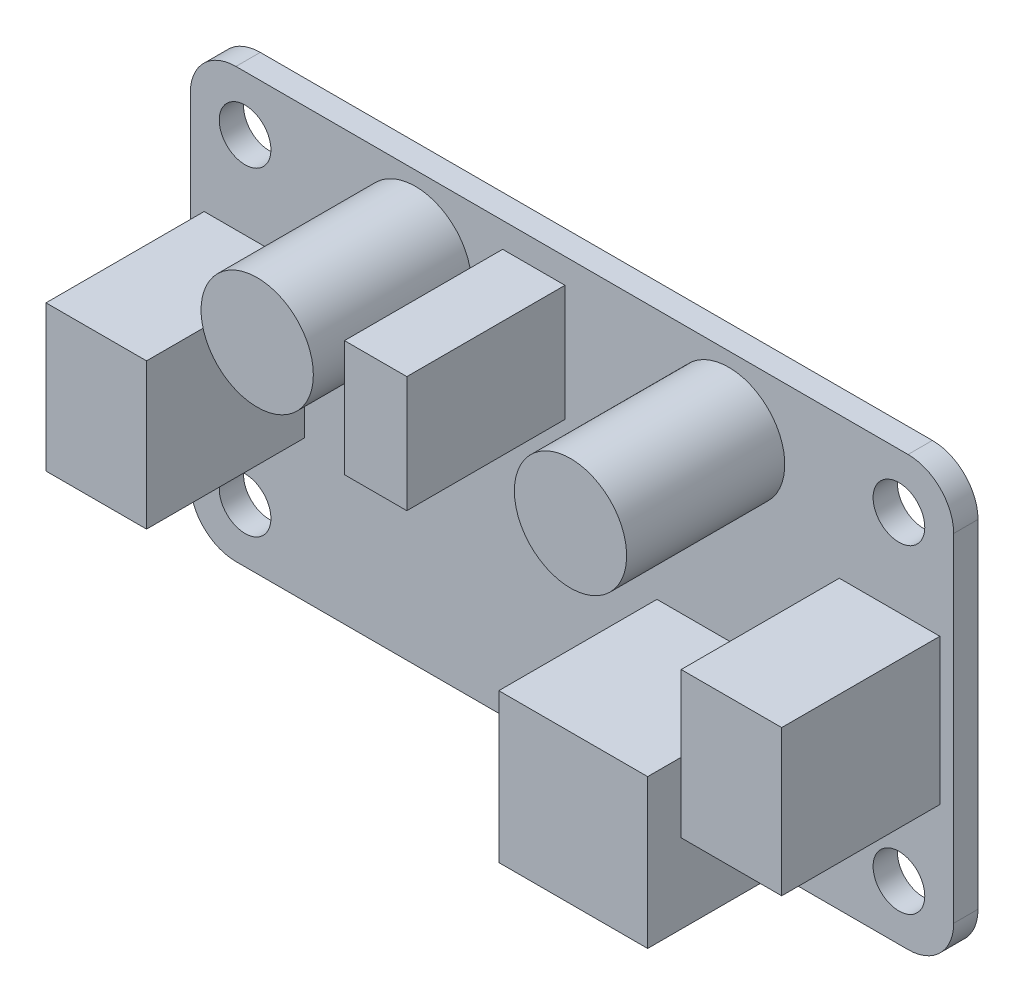
ISO-10303-21;
HEADER;
FILE_DESCRIPTION(('STEP AP214'),'2;1');
FILE_NAME('part.step','',(''),(''),'','','');
FILE_SCHEMA(('AUTOMOTIVE_DESIGN { 1 0 10303 214 1 1 1 1 }'));
ENDSEC;
DATA;
#1=APPLICATION_CONTEXT('core data for automotive mechanical design processes');
#2=APPLICATION_PROTOCOL_DEFINITION('international standard','automotive_design',2000,#1);
#3=PRODUCT_CONTEXT('',#1,'mechanical');
#4=PRODUCT('Part','Part','',(#3));
#5=PRODUCT_RELATED_PRODUCT_CATEGORY('part','',(#4));
#6=PRODUCT_DEFINITION_FORMATION('','',#4);
#7=PRODUCT_DEFINITION_CONTEXT('part definition',#1,'design');
#8=PRODUCT_DEFINITION('design','',#6,#7);
#9=PRODUCT_DEFINITION_SHAPE('','',#8);
#10=(LENGTH_UNIT() NAMED_UNIT(*) SI_UNIT(.MILLI.,.METRE.));
#11=(NAMED_UNIT(*) PLANE_ANGLE_UNIT() SI_UNIT($,.RADIAN.));
#12=(NAMED_UNIT(*) SI_UNIT($,.STERADIAN.) SOLID_ANGLE_UNIT());
#13=UNCERTAINTY_MEASURE_WITH_UNIT(LENGTH_MEASURE(1.E-05),#10,'distance_accuracy_value','');
#14=(GEOMETRIC_REPRESENTATION_CONTEXT(3) GLOBAL_UNCERTAINTY_ASSIGNED_CONTEXT((#13)) GLOBAL_UNIT_ASSIGNED_CONTEXT((#10,
#11,#12)) REPRESENTATION_CONTEXT('',''));
#15=CARTESIAN_POINT('',(0.,0.,0.));
#16=DIRECTION('',(0.,0.,1.));
#17=DIRECTION('',(1.,0.,0.));
#18=AXIS2_PLACEMENT_3D('',#15,#16,#17);
#19=CARTESIAN_POINT('',(0.,0.,1.6));
#20=DIRECTION('',(0.,0.,1.));
#21=DIRECTION('',(1.,0.,0.));
#22=AXIS2_PLACEMENT_3D('',#19,#20,#21);
#23=PLANE('',#22);
#24=CARTESIAN_POINT('',(10.3015568216441,9.48153239803066,1.6));
#25=DIRECTION('',(0.,0.,1.));
#26=DIRECTION('',(-1.,0.,0.));
#27=AXIS2_PLACEMENT_3D('',#24,#25,#26);
#28=CIRCLE('',#27,3.6918890442581);
#29=CARTESIAN_POINT('',(6.60966777738602,9.48153239803066,1.6));
#30=VERTEX_POINT('',#29);
#31=EDGE_CURVE('E251',#30,#30,#28,.T.);
#32=ORIENTED_EDGE('',*,*,#31,.F.);
#33=EDGE_LOOP('',(#32));
#34=FACE_BOUND('',#33,.T.);
#35=CARTESIAN_POINT('',(-10.3015568216441,9.48153239803066,1.6));
#36=DIRECTION('',(0.,0.,1.));
#37=DIRECTION('',(1.,0.,0.));
#38=AXIS2_PLACEMENT_3D('',#35,#36,#37);
#39=CIRCLE('',#38,3.6918890442581);
#40=CARTESIAN_POINT('',(-6.60966777738602,9.48153239803066,1.6));
#41=VERTEX_POINT('',#40);
#42=EDGE_CURVE('E255',#41,#41,#39,.T.);
#43=ORIENTED_EDGE('',*,*,#42,.F.);
#44=EDGE_LOOP('',(#43));
#45=FACE_BOUND('',#44,.T.);
#46=CARTESIAN_POINT('',(-21.5,10.5,1.6));
#47=DIRECTION('',(0.,0.,1.));
#48=DIRECTION('',(1.,0.,0.));
#49=AXIS2_PLACEMENT_3D('',#46,#47,#48);
#50=CIRCLE('',#49,1.69999999999999);
#51=CARTESIAN_POINT('',(-19.8,10.5,1.6));
#52=VERTEX_POINT('',#51);
#53=EDGE_CURVE('E321',#52,#52,#50,.T.);
#54=ORIENTED_EDGE('',*,*,#53,.F.);
#55=EDGE_LOOP('',(#54));
#56=FACE_BOUND('',#55,.T.);
#57=CARTESIAN_POINT('',(21.5,10.5,1.6));
#58=DIRECTION('',(0.,0.,1.));
#59=DIRECTION('',(1.,0.,0.));
#60=AXIS2_PLACEMENT_3D('',#57,#58,#59);
#61=CIRCLE('',#60,1.69999999999999);
#62=CARTESIAN_POINT('',(23.2,10.5,1.6));
#63=VERTEX_POINT('',#62);
#64=EDGE_CURVE('E327',#63,#63,#61,.T.);
#65=ORIENTED_EDGE('',*,*,#64,.F.);
#66=EDGE_LOOP('',(#65));
#67=FACE_BOUND('',#66,.T.);
#68=CARTESIAN_POINT('',(21.5,-10.5,1.6));
#69=DIRECTION('',(0.,0.,1.));
#70=DIRECTION('',(1.,0.,0.));
#71=AXIS2_PLACEMENT_3D('',#68,#69,#70);
#72=CIRCLE('',#71,1.69999999999999);
#73=CARTESIAN_POINT('',(23.2,-10.5,1.6));
#74=VERTEX_POINT('',#73);
#75=EDGE_CURVE('E333',#74,#74,#72,.T.);
#76=ORIENTED_EDGE('',*,*,#75,.F.);
#77=EDGE_LOOP('',(#76));
#78=FACE_BOUND('',#77,.T.);
#79=CARTESIAN_POINT('',(-21.5,-10.5,1.6));
#80=DIRECTION('',(0.,0.,1.));
#81=DIRECTION('',(1.,0.,0.));
#82=AXIS2_PLACEMENT_3D('',#79,#80,#81);
#83=CIRCLE('',#82,1.69999999999999);
#84=CARTESIAN_POINT('',(-19.8,-10.5,1.6));
#85=VERTEX_POINT('',#84);
#86=EDGE_CURVE('E339',#85,#85,#83,.T.);
#87=ORIENTED_EDGE('',*,*,#86,.F.);
#88=EDGE_LOOP('',(#87));
#89=FACE_BOUND('',#88,.T.);
#90=DIRECTION('',(-1.,0.,0.));
#91=VECTOR('',#90,1.);
#92=CARTESIAN_POINT('',(-25.1,14.1,1.6));
#93=LINE('',#92,#91);
#94=CARTESIAN_POINT('',(22.1,14.1,1.6));
#95=VERTEX_POINT('',#94);
#96=CARTESIAN_POINT('',(-22.1,14.1,1.6));
#97=VERTEX_POINT('',#96);
#98=EDGE_CURVE('E356',#95,#97,#93,.T.);
#99=ORIENTED_EDGE('',*,*,#98,.T.);
#100=CARTESIAN_POINT('',(-22.1,11.1,1.6));
#101=DIRECTION('',(0.,0.,1.));
#102=DIRECTION('',(1.,0.,0.));
#103=AXIS2_PLACEMENT_3D('',#100,#101,#102);
#104=CIRCLE('',#103,3.);
#105=CARTESIAN_POINT('',(-25.1,11.1,1.6));
#106=VERTEX_POINT('',#105);
#107=EDGE_CURVE('E393',#97,#106,#104,.T.);
#108=ORIENTED_EDGE('',*,*,#107,.T.);
#109=DIRECTION('',(0.,-1.,0.));
#110=VECTOR('',#109,1.);
#111=CARTESIAN_POINT('',(-25.1,14.1,1.6));
#112=LINE('',#111,#110);
#113=CARTESIAN_POINT('',(-25.1,-11.1,1.6));
#114=VERTEX_POINT('',#113);
#115=EDGE_CURVE('E346',#106,#114,#112,.T.);
#116=ORIENTED_EDGE('',*,*,#115,.T.);
#117=CARTESIAN_POINT('',(-22.1,-11.1,1.6));
#118=DIRECTION('',(0.,0.,1.));
#119=DIRECTION('',(1.,0.,0.));
#120=AXIS2_PLACEMENT_3D('',#117,#118,#119);
#121=CIRCLE('',#120,3.);
#122=CARTESIAN_POINT('',(-22.1,-14.1,1.6));
#123=VERTEX_POINT('',#122);
#124=EDGE_CURVE('E387',#114,#123,#121,.T.);
#125=ORIENTED_EDGE('',*,*,#124,.T.);
#126=DIRECTION('',(1.,0.,0.));
#127=VECTOR('',#126,1.);
#128=CARTESIAN_POINT('',(-25.1,-14.1,1.6));
#129=LINE('',#128,#127);
#130=CARTESIAN_POINT('',(22.1,-14.1,1.6));
#131=VERTEX_POINT('',#130);
#132=EDGE_CURVE('E349',#123,#131,#129,.T.);
#133=ORIENTED_EDGE('',*,*,#132,.T.);
#134=CARTESIAN_POINT('',(22.1,-11.1,1.6));
#135=DIRECTION('',(0.,0.,1.));
#136=DIRECTION('',(1.,0.,0.));
#137=AXIS2_PLACEMENT_3D('',#134,#135,#136);
#138=CIRCLE('',#137,3.);
#139=CARTESIAN_POINT('',(25.1,-11.1,1.6));
#140=VERTEX_POINT('',#139);
#141=EDGE_CURVE('E389',#131,#140,#138,.T.);
#142=ORIENTED_EDGE('',*,*,#141,.T.);
#143=DIRECTION('',(0.,1.,0.));
#144=VECTOR('',#143,1.);
#145=CARTESIAN_POINT('',(25.1,14.1,1.6));
#146=LINE('',#145,#144);
#147=CARTESIAN_POINT('',(25.1,11.1,1.6));
#148=VERTEX_POINT('',#147);
#149=EDGE_CURVE('E353',#140,#148,#146,.T.);
#150=ORIENTED_EDGE('',*,*,#149,.T.);
#151=CARTESIAN_POINT('',(22.1,11.1,1.6));
#152=DIRECTION('',(0.,0.,1.));
#153=DIRECTION('',(1.,0.,0.));
#154=AXIS2_PLACEMENT_3D('',#151,#152,#153);
#155=CIRCLE('',#154,3.);
#156=EDGE_CURVE('E391',#148,#95,#155,.T.);
#157=ORIENTED_EDGE('',*,*,#156,.T.);
#158=EDGE_LOOP('',(#99,#108,#116,#125,#133,#142,#150,#157));
#159=FACE_BOUND('',#158,.T.);
#160=DIRECTION('',(1.,0.,0.));
#161=VECTOR('',#160,1.);
#162=CARTESIAN_POINT('',(-24.1907204965971,-4.79201772549117,1.6));
#163=LINE('',#162,#161);
#164=CARTESIAN_POINT('',(-24.1907204965971,-4.79201772549117,1.6));
#165=VERTEX_POINT('',#164);
#166=CARTESIAN_POINT('',(-17.5792735812136,-4.79201772549117,1.6));
#167=VERTEX_POINT('',#166);
#168=EDGE_CURVE('E306',#165,#167,#163,.T.);
#169=ORIENTED_EDGE('',*,*,#168,.F.);
#170=DIRECTION('',(0.,-1.,0.));
#171=VECTOR('',#170,1.);
#172=CARTESIAN_POINT('',(-24.1907204965971,4.79201772549117,1.6));
#173=LINE('',#172,#171);
#174=CARTESIAN_POINT('',(-24.1907204965971,4.79201772549117,1.6));
#175=VERTEX_POINT('',#174);
#176=EDGE_CURVE('E292',#175,#165,#173,.T.);
#177=ORIENTED_EDGE('',*,*,#176,.F.);
#178=DIRECTION('',(-1.,0.,0.));
#179=VECTOR('',#178,1.);
#180=CARTESIAN_POINT('',(-24.1907204965971,4.79201772549117,1.6));
#181=LINE('',#180,#179);
#182=CARTESIAN_POINT('',(-17.5792735812136,4.79201772549117,1.6));
#183=VERTEX_POINT('',#182);
#184=EDGE_CURVE('E297',#183,#175,#181,.T.);
#185=ORIENTED_EDGE('',*,*,#184,.F.);
#186=DIRECTION('',(0.,1.,0.));
#187=VECTOR('',#186,1.);
#188=CARTESIAN_POINT('',(-17.5792735812136,4.79201772549117,1.6));
#189=LINE('',#188,#187);
#190=EDGE_CURVE('E308',#167,#183,#189,.T.);
#191=ORIENTED_EDGE('',*,*,#190,.F.);
#192=EDGE_LOOP('',(#169,#177,#185,#191));
#193=FACE_BOUND('',#192,.T.);
#194=DIRECTION('',(0.,-1.,0.));
#195=VECTOR('',#194,1.);
#196=CARTESIAN_POINT('',(17.5792735812136,4.79201772549117,1.6));
#197=LINE('',#196,#195);
#198=CARTESIAN_POINT('',(17.5792735812136,4.79201772549117,1.6));
#199=VERTEX_POINT('',#198);
#200=CARTESIAN_POINT('',(17.5792735812136,-4.79201772549117,1.6));
#201=VERTEX_POINT('',#200);
#202=EDGE_CURVE('E277',#199,#201,#197,.T.);
#203=ORIENTED_EDGE('',*,*,#202,.F.);
#204=DIRECTION('',(-1.,0.,0.));
#205=VECTOR('',#204,1.);
#206=CARTESIAN_POINT('',(24.1907204965971,4.79201772549117,1.6));
#207=LINE('',#206,#205);
#208=CARTESIAN_POINT('',(24.1907204965971,4.79201772549117,1.6));
#209=VERTEX_POINT('',#208);
#210=EDGE_CURVE('E261',#209,#199,#207,.T.);
#211=ORIENTED_EDGE('',*,*,#210,.F.);
#212=DIRECTION('',(0.,1.,0.));
#213=VECTOR('',#212,1.);
#214=CARTESIAN_POINT('',(24.1907204965971,4.79201772549117,1.6));
#215=LINE('',#214,#213);
#216=CARTESIAN_POINT('',(24.1907204965971,-4.79201772549117,1.6));
#217=VERTEX_POINT('',#216);
#218=EDGE_CURVE('E268',#217,#209,#215,.T.);
#219=ORIENTED_EDGE('',*,*,#218,.F.);
#220=DIRECTION('',(1.,0.,0.));
#221=VECTOR('',#220,1.);
#222=CARTESIAN_POINT('',(24.1907204965971,-4.79201772549117,1.6));
#223=LINE('',#222,#221);
#224=EDGE_CURVE('E279',#201,#217,#223,.T.);
#225=ORIENTED_EDGE('',*,*,#224,.F.);
#226=EDGE_LOOP('',(#203,#211,#219,#225));
#227=FACE_BOUND('',#226,.T.);
#228=DIRECTION('',(1.,0.,0.));
#229=VECTOR('',#228,1.);
#230=CARTESIAN_POINT('',(-4.56138585634989,4.8176434887291,1.6));
#231=LINE('',#230,#229);
#232=CARTESIAN_POINT('',(-4.56138585634989,4.8176434887291,1.6));
#233=VERTEX_POINT('',#232);
#234=CARTESIAN_POINT('',(-0.46126373828257,4.8176434887291,1.6));
#235=VERTEX_POINT('',#234);
#236=EDGE_CURVE('E223',#233,#235,#231,.T.);
#237=ORIENTED_EDGE('',*,*,#236,.F.);
#238=DIRECTION('',(0.,-1.,0.));
#239=VECTOR('',#238,1.);
#240=CARTESIAN_POINT('',(-4.56138585634989,12.4541209336295,1.6));
#241=LINE('',#240,#239);
#242=CARTESIAN_POINT('',(-4.56138585634989,12.4541209336295,1.6));
#243=VERTEX_POINT('',#242);
#244=EDGE_CURVE('E220',#243,#233,#241,.T.);
#245=ORIENTED_EDGE('',*,*,#244,.F.);
#246=DIRECTION('',(-1.,0.,0.));
#247=VECTOR('',#246,1.);
#248=CARTESIAN_POINT('',(-4.56138585634989,12.4541209336295,1.6));
#249=LINE('',#248,#247);
#250=CARTESIAN_POINT('',(-0.46126373828257,12.4541209336295,1.6));
#251=VERTEX_POINT('',#250);
#252=EDGE_CURVE('E232',#251,#243,#249,.T.);
#253=ORIENTED_EDGE('',*,*,#252,.F.);
#254=DIRECTION('',(0.,1.,0.));
#255=VECTOR('',#254,1.);
#256=CARTESIAN_POINT('',(-0.46126373828257,12.4541209336295,1.6));
#257=LINE('',#256,#255);
#258=EDGE_CURVE('E240',#235,#251,#257,.T.);
#259=ORIENTED_EDGE('',*,*,#258,.F.);
#260=EDGE_LOOP('',(#237,#245,#253,#259));
#261=FACE_BOUND('',#260,.T.);
#262=DIRECTION('',(1.,0.,0.));
#263=VECTOR('',#262,1.);
#264=CARTESIAN_POINT('',(5.58641638586671,-12.1978633012502,1.6));
#265=LINE('',#264,#263);
#266=CARTESIAN_POINT('',(5.58641638586671,-12.1978633012502,1.6));
#267=VERTEX_POINT('',#266);
#268=CARTESIAN_POINT('',(15.3754579427524,-12.1978633012502,1.6));
#269=VERTEX_POINT('',#268);
#270=EDGE_CURVE('E833',#267,#269,#265,.T.);
#271=ORIENTED_EDGE('',*,*,#270,.F.);
#272=DIRECTION('',(0.,-1.,0.));
#273=VECTOR('',#272,1.);
#274=CARTESIAN_POINT('',(5.58641638586671,-2.40882174436455,1.6));
#275=LINE('',#274,#273);
#276=CARTESIAN_POINT('',(5.58641638586671,-2.40882174436455,1.6));
#277=VERTEX_POINT('',#276);
#278=EDGE_CURVE('E218',#277,#267,#275,.T.);
#279=ORIENTED_EDGE('',*,*,#278,.F.);
#280=DIRECTION('',(-1.,0.,0.));
#281=VECTOR('',#280,1.);
#282=CARTESIAN_POINT('',(5.58641638586671,-2.40882174436455,1.6));
#283=LINE('',#282,#281);
#284=CARTESIAN_POINT('',(15.3754579427524,-2.40882174436455,1.6));
#285=VERTEX_POINT('',#284);
#286=EDGE_CURVE('E214',#285,#277,#283,.T.);
#287=ORIENTED_EDGE('',*,*,#286,.F.);
#288=DIRECTION('',(0.,1.,0.));
#289=VECTOR('',#288,1.);
#290=CARTESIAN_POINT('',(15.3754579427524,-2.40882174436455,1.6));
#291=LINE('',#290,#289);
#292=EDGE_CURVE('E830',#269,#285,#291,.T.);
#293=ORIENTED_EDGE('',*,*,#292,.F.);
#294=EDGE_LOOP('',(#271,#279,#287,#293));
#295=FACE_BOUND('',#294,.T.);
#296=ADVANCED_FACE('F34',(#34,#45,#56,#67,#78,#89,#159,#193,#227,#261,#295),#23,.T.);
#297=CARTESIAN_POINT('',(-25.1,14.1,1.6));
#298=DIRECTION('',(1.,0.,0.));
#299=DIRECTION('',(0.,0.,-1.));
#300=AXIS2_PLACEMENT_3D('',#297,#298,#299);
#301=PLANE('',#300);
#302=ORIENTED_EDGE('',*,*,#115,.F.);
#303=DIRECTION('',(0.,0.,-1.));
#304=VECTOR('',#303,1.);
#305=CARTESIAN_POINT('',(-25.1,11.1,1.6));
#306=LINE('',#305,#304);
#307=CARTESIAN_POINT('',(-25.1,11.1,0.));
#308=VERTEX_POINT('',#307);
#309=EDGE_CURVE('E371',#106,#308,#306,.T.);
#310=ORIENTED_EDGE('',*,*,#309,.T.);
#311=DIRECTION('',(0.,-1.,0.));
#312=VECTOR('',#311,1.);
#313=CARTESIAN_POINT('',(-25.1,14.1,0.));
#314=LINE('',#313,#312);
#315=CARTESIAN_POINT('',(-25.1,-11.1,0.));
#316=VERTEX_POINT('',#315);
#317=EDGE_CURVE('E345',#308,#316,#314,.T.);
#318=ORIENTED_EDGE('',*,*,#317,.T.);
#319=DIRECTION('',(0.,0.,-1.));
#320=VECTOR('',#319,1.);
#321=CARTESIAN_POINT('',(-25.1,-11.1,1.6));
#322=LINE('',#321,#320);
#323=EDGE_CURVE('E359',#316,#114,#322,.F.);
#324=ORIENTED_EDGE('',*,*,#323,.T.);
#325=EDGE_LOOP('',(#302,#310,#318,#324));
#326=FACE_BOUND('',#325,.T.);
#327=ADVANCED_FACE('F437',(#326),#301,.F.);
#328=CARTESIAN_POINT('',(-25.1,-14.1,1.6));
#329=DIRECTION('',(0.,1.,0.));
#330=DIRECTION('',(-1.,0.,0.));
#331=AXIS2_PLACEMENT_3D('',#328,#329,#330);
#332=PLANE('',#331);
#333=DIRECTION('',(1.,0.,0.));
#334=VECTOR('',#333,1.);
#335=CARTESIAN_POINT('',(-25.1,-14.1,0.));
#336=LINE('',#335,#334);
#337=CARTESIAN_POINT('',(-22.1,-14.1,0.));
#338=VERTEX_POINT('',#337);
#339=CARTESIAN_POINT('',(22.1,-14.1,0.));
#340=VERTEX_POINT('',#339);
#341=EDGE_CURVE('E362',#338,#340,#336,.T.);
#342=ORIENTED_EDGE('',*,*,#341,.T.);
#343=DIRECTION('',(0.,0.,-1.));
#344=VECTOR('',#343,1.);
#345=CARTESIAN_POINT('',(22.1,-14.1,1.6));
#346=LINE('',#345,#344);
#347=EDGE_CURVE('E11',#340,#131,#346,.F.);
#348=ORIENTED_EDGE('',*,*,#347,.T.);
#349=ORIENTED_EDGE('',*,*,#132,.F.);
#350=DIRECTION('',(0.,0.,-1.));
#351=VECTOR('',#350,1.);
#352=CARTESIAN_POINT('',(-22.1,-14.1,1.6));
#353=LINE('',#352,#351);
#354=EDGE_CURVE('E42',#123,#338,#353,.T.);
#355=ORIENTED_EDGE('',*,*,#354,.T.);
#356=EDGE_LOOP('',(#342,#348,#349,#355));
#357=FACE_BOUND('',#356,.T.);
#358=ADVANCED_FACE('F404',(#357),#332,.F.);
#359=CARTESIAN_POINT('',(25.1,14.1,1.6));
#360=DIRECTION('',(-1.,0.,0.));
#361=DIRECTION('',(0.,0.,1.));
#362=AXIS2_PLACEMENT_3D('',#359,#360,#361);
#363=PLANE('',#362);
#364=DIRECTION('',(0.,1.,0.));
#365=VECTOR('',#364,1.);
#366=CARTESIAN_POINT('',(25.1,14.1,0.));
#367=LINE('',#366,#365);
#368=CARTESIAN_POINT('',(25.1,-11.1,0.));
#369=VERTEX_POINT('',#368);
#370=CARTESIAN_POINT('',(25.1,11.1,0.));
#371=VERTEX_POINT('',#370);
#372=EDGE_CURVE('E365',#369,#371,#367,.T.);
#373=ORIENTED_EDGE('',*,*,#372,.T.);
#374=DIRECTION('',(0.,0.,-1.));
#375=VECTOR('',#374,1.);
#376=CARTESIAN_POINT('',(25.1,11.1,1.6));
#377=LINE('',#376,#375);
#378=EDGE_CURVE('E398',#371,#148,#377,.F.);
#379=ORIENTED_EDGE('',*,*,#378,.T.);
#380=ORIENTED_EDGE('',*,*,#149,.F.);
#381=DIRECTION('',(0.,0.,-1.));
#382=VECTOR('',#381,1.);
#383=CARTESIAN_POINT('',(25.1,-11.1,1.6));
#384=LINE('',#383,#382);
#385=EDGE_CURVE('E395',#140,#369,#384,.T.);
#386=ORIENTED_EDGE('',*,*,#385,.T.);
#387=EDGE_LOOP('',(#373,#379,#380,#386));
#388=FACE_BOUND('',#387,.T.);
#389=ADVANCED_FACE('F418',(#388),#363,.F.);
#390=CARTESIAN_POINT('',(-25.1,14.1,1.6));
#391=DIRECTION('',(0.,-1.,0.));
#392=DIRECTION('',(1.,0.,0.));
#393=AXIS2_PLACEMENT_3D('',#390,#391,#392);
#394=PLANE('',#393);
#395=DIRECTION('',(-1.,0.,0.));
#396=VECTOR('',#395,1.);
#397=CARTESIAN_POINT('',(-25.1,14.1,0.));
#398=LINE('',#397,#396);
#399=CARTESIAN_POINT('',(22.1,14.1,0.));
#400=VERTEX_POINT('',#399);
#401=CARTESIAN_POINT('',(-22.1,14.1,0.));
#402=VERTEX_POINT('',#401);
#403=EDGE_CURVE('E350',#400,#402,#398,.T.);
#404=ORIENTED_EDGE('',*,*,#403,.T.);
#405=DIRECTION('',(0.,0.,-1.));
#406=VECTOR('',#405,1.);
#407=CARTESIAN_POINT('',(-22.1,14.1,1.6));
#408=LINE('',#407,#406);
#409=EDGE_CURVE('E385',#402,#97,#408,.F.);
#410=ORIENTED_EDGE('',*,*,#409,.T.);
#411=ORIENTED_EDGE('',*,*,#98,.F.);
#412=DIRECTION('',(0.,0.,-1.));
#413=VECTOR('',#412,1.);
#414=CARTESIAN_POINT('',(22.1,14.1,1.6));
#415=LINE('',#414,#413);
#416=EDGE_CURVE('E382',#95,#400,#415,.T.);
#417=ORIENTED_EDGE('',*,*,#416,.T.);
#418=EDGE_LOOP('',(#404,#410,#411,#417));
#419=FACE_BOUND('',#418,.T.);
#420=ADVANCED_FACE('F429',(#419),#394,.F.);
#421=CARTESIAN_POINT('',(0.,0.,0.));
#422=DIRECTION('',(0.,0.,1.));
#423=DIRECTION('',(1.,0.,0.));
#424=AXIS2_PLACEMENT_3D('',#421,#422,#423);
#425=PLANE('',#424);
#426=CARTESIAN_POINT('',(-21.5,10.5,0.));
#427=DIRECTION('',(0.,0.,1.));
#428=DIRECTION('',(1.,0.,0.));
#429=AXIS2_PLACEMENT_3D('',#426,#427,#428);
#430=CIRCLE('',#429,1.7);
#431=CARTESIAN_POINT('',(-19.8,10.5,0.));
#432=VERTEX_POINT('',#431);
#433=EDGE_CURVE('E324',#432,#432,#430,.T.);
#434=ORIENTED_EDGE('',*,*,#433,.T.);
#435=EDGE_LOOP('',(#434));
#436=FACE_BOUND('',#435,.T.);
#437=CARTESIAN_POINT('',(21.5,10.5,0.));
#438=DIRECTION('',(0.,0.,1.));
#439=DIRECTION('',(1.,0.,0.));
#440=AXIS2_PLACEMENT_3D('',#437,#438,#439);
#441=CIRCLE('',#440,1.7);
#442=CARTESIAN_POINT('',(23.2,10.5,0.));
#443=VERTEX_POINT('',#442);
#444=EDGE_CURVE('E330',#443,#443,#441,.T.);
#445=ORIENTED_EDGE('',*,*,#444,.T.);
#446=EDGE_LOOP('',(#445));
#447=FACE_BOUND('',#446,.T.);
#448=CARTESIAN_POINT('',(21.5,-10.5,0.));
#449=DIRECTION('',(0.,0.,1.));
#450=DIRECTION('',(1.,0.,0.));
#451=AXIS2_PLACEMENT_3D('',#448,#449,#450);
#452=CIRCLE('',#451,1.7);
#453=CARTESIAN_POINT('',(23.2,-10.5,0.));
#454=VERTEX_POINT('',#453);
#455=EDGE_CURVE('E336',#454,#454,#452,.T.);
#456=ORIENTED_EDGE('',*,*,#455,.T.);
#457=EDGE_LOOP('',(#456));
#458=FACE_BOUND('',#457,.T.);
#459=CARTESIAN_POINT('',(-21.5,-10.5,0.));
#460=DIRECTION('',(0.,0.,1.));
#461=DIRECTION('',(1.,0.,0.));
#462=AXIS2_PLACEMENT_3D('',#459,#460,#461);
#463=CIRCLE('',#462,1.7);
#464=CARTESIAN_POINT('',(-19.8,-10.5,0.));
#465=VERTEX_POINT('',#464);
#466=EDGE_CURVE('E342',#465,#465,#463,.T.);
#467=ORIENTED_EDGE('',*,*,#466,.T.);
#468=EDGE_LOOP('',(#467));
#469=FACE_BOUND('',#468,.T.);
#470=ORIENTED_EDGE('',*,*,#317,.F.);
#471=CARTESIAN_POINT('',(-22.1,11.1,0.));
#472=DIRECTION('',(0.,0.,1.));
#473=DIRECTION('',(1.,0.,0.));
#474=AXIS2_PLACEMENT_3D('',#471,#472,#473);
#475=CIRCLE('',#474,3.);
#476=EDGE_CURVE('E380',#308,#402,#475,.F.);
#477=ORIENTED_EDGE('',*,*,#476,.T.);
#478=ORIENTED_EDGE('',*,*,#403,.F.);
#479=CARTESIAN_POINT('',(22.1,11.1,0.));
#480=DIRECTION('',(0.,0.,1.));
#481=DIRECTION('',(1.,0.,0.));
#482=AXIS2_PLACEMENT_3D('',#479,#480,#481);
#483=CIRCLE('',#482,3.);
#484=EDGE_CURVE('E378',#400,#371,#483,.F.);
#485=ORIENTED_EDGE('',*,*,#484,.T.);
#486=ORIENTED_EDGE('',*,*,#372,.F.);
#487=CARTESIAN_POINT('',(22.1,-11.1,0.));
#488=DIRECTION('',(0.,0.,1.));
#489=DIRECTION('',(1.,0.,0.));
#490=AXIS2_PLACEMENT_3D('',#487,#488,#489);
#491=CIRCLE('',#490,3.);
#492=EDGE_CURVE('E376',#369,#340,#491,.F.);
#493=ORIENTED_EDGE('',*,*,#492,.T.);
#494=ORIENTED_EDGE('',*,*,#341,.F.);
#495=CARTESIAN_POINT('',(-22.1,-11.1,0.));
#496=DIRECTION('',(0.,0.,1.));
#497=DIRECTION('',(1.,0.,0.));
#498=AXIS2_PLACEMENT_3D('',#495,#496,#497);
#499=CIRCLE('',#498,3.);
#500=EDGE_CURVE('E374',#338,#316,#499,.F.);
#501=ORIENTED_EDGE('',*,*,#500,.T.);
#502=EDGE_LOOP('',(#470,#477,#478,#485,#486,#493,#494,#501));
#503=FACE_BOUND('',#502,.T.);
#504=ADVANCED_FACE('F410',(#436,#447,#458,#469,#503),#425,.F.);
#505=CARTESIAN_POINT('',(-21.5,-10.5,1.6));
#506=DIRECTION('',(0.,0.,1.));
#507=DIRECTION('',(1.,0.,0.));
#508=AXIS2_PLACEMENT_3D('',#505,#506,#507);
#509=CYLINDRICAL_SURFACE('',#508,1.69999999999999);
#510=ORIENTED_EDGE('',*,*,#466,.F.);
#511=EDGE_LOOP('',(#510));
#512=FACE_BOUND('',#511,.T.);
#513=ORIENTED_EDGE('',*,*,#86,.T.);
#514=EDGE_LOOP('',(#513));
#515=FACE_BOUND('',#514,.T.);
#516=ADVANCED_FACE('F459',(#512,#515),#509,.F.);
#517=CARTESIAN_POINT('',(21.5,-10.5,1.6));
#518=DIRECTION('',(0.,0.,1.));
#519=DIRECTION('',(1.,0.,0.));
#520=AXIS2_PLACEMENT_3D('',#517,#518,#519);
#521=CYLINDRICAL_SURFACE('',#520,1.69999999999999);
#522=ORIENTED_EDGE('',*,*,#455,.F.);
#523=EDGE_LOOP('',(#522));
#524=FACE_BOUND('',#523,.T.);
#525=ORIENTED_EDGE('',*,*,#75,.T.);
#526=EDGE_LOOP('',(#525));
#527=FACE_BOUND('',#526,.T.);
#528=ADVANCED_FACE('F741',(#524,#527),#521,.F.);
#529=CARTESIAN_POINT('',(21.5,10.5,1.6));
#530=DIRECTION('',(0.,0.,1.));
#531=DIRECTION('',(1.,0.,0.));
#532=AXIS2_PLACEMENT_3D('',#529,#530,#531);
#533=CYLINDRICAL_SURFACE('',#532,1.69999999999999);
#534=ORIENTED_EDGE('',*,*,#444,.F.);
#535=EDGE_LOOP('',(#534));
#536=FACE_BOUND('',#535,.T.);
#537=ORIENTED_EDGE('',*,*,#64,.T.);
#538=EDGE_LOOP('',(#537));
#539=FACE_BOUND('',#538,.T.);
#540=ADVANCED_FACE('F738',(#536,#539),#533,.F.);
#541=CARTESIAN_POINT('',(-21.5,10.5,1.6));
#542=DIRECTION('',(0.,0.,1.));
#543=DIRECTION('',(1.,0.,0.));
#544=AXIS2_PLACEMENT_3D('',#541,#542,#543);
#545=CYLINDRICAL_SURFACE('',#544,1.69999999999999);
#546=ORIENTED_EDGE('',*,*,#433,.F.);
#547=EDGE_LOOP('',(#546));
#548=FACE_BOUND('',#547,.T.);
#549=ORIENTED_EDGE('',*,*,#53,.T.);
#550=EDGE_LOOP('',(#549));
#551=FACE_BOUND('',#550,.T.);
#552=ADVANCED_FACE('F472',(#548,#551),#545,.F.);
#553=CARTESIAN_POINT('',(-22.1,11.1,1.6));
#554=DIRECTION('',(0.,0.,-1.));
#555=DIRECTION('',(-1.,0.,0.));
#556=AXIS2_PLACEMENT_3D('',#553,#554,#555);
#557=CYLINDRICAL_SURFACE('',#556,3.);
#558=ORIENTED_EDGE('',*,*,#107,.F.);
#559=ORIENTED_EDGE('',*,*,#409,.F.);
#560=ORIENTED_EDGE('',*,*,#476,.F.);
#561=ORIENTED_EDGE('',*,*,#309,.F.);
#562=EDGE_LOOP('',(#558,#559,#560,#561));
#563=FACE_BOUND('',#562,.T.);
#564=ADVANCED_FACE('F434',(#563),#557,.T.);
#565=CARTESIAN_POINT('',(22.1,11.1,1.6));
#566=DIRECTION('',(0.,0.,-1.));
#567=DIRECTION('',(-1.,0.,0.));
#568=AXIS2_PLACEMENT_3D('',#565,#566,#567);
#569=CYLINDRICAL_SURFACE('',#568,3.);
#570=ORIENTED_EDGE('',*,*,#156,.F.);
#571=ORIENTED_EDGE('',*,*,#378,.F.);
#572=ORIENTED_EDGE('',*,*,#484,.F.);
#573=ORIENTED_EDGE('',*,*,#416,.F.);
#574=EDGE_LOOP('',(#570,#571,#572,#573));
#575=FACE_BOUND('',#574,.T.);
#576=ADVANCED_FACE('F426',(#575),#569,.T.);
#577=CARTESIAN_POINT('',(22.1,-11.1,1.6));
#578=DIRECTION('',(0.,0.,-1.));
#579=DIRECTION('',(-1.,0.,0.));
#580=AXIS2_PLACEMENT_3D('',#577,#578,#579);
#581=CYLINDRICAL_SURFACE('',#580,3.);
#582=ORIENTED_EDGE('',*,*,#141,.F.);
#583=ORIENTED_EDGE('',*,*,#347,.F.);
#584=ORIENTED_EDGE('',*,*,#492,.F.);
#585=ORIENTED_EDGE('',*,*,#385,.F.);
#586=EDGE_LOOP('',(#582,#583,#584,#585));
#587=FACE_BOUND('',#586,.T.);
#588=ADVANCED_FACE('F415',(#587),#581,.T.);
#589=CARTESIAN_POINT('',(-22.1,-11.1,1.6));
#590=DIRECTION('',(0.,0.,-1.));
#591=DIRECTION('',(-1.,0.,0.));
#592=AXIS2_PLACEMENT_3D('',#589,#590,#591);
#593=CYLINDRICAL_SURFACE('',#592,3.);
#594=ORIENTED_EDGE('',*,*,#124,.F.);
#595=ORIENTED_EDGE('',*,*,#323,.F.);
#596=ORIENTED_EDGE('',*,*,#500,.F.);
#597=ORIENTED_EDGE('',*,*,#354,.F.);
#598=EDGE_LOOP('',(#594,#595,#596,#597));
#599=FACE_BOUND('',#598,.T.);
#600=ADVANCED_FACE('F36',(#599),#593,.T.);
#601=CARTESIAN_POINT('',(-24.1907204965971,4.79201772549117,12.));
#602=DIRECTION('',(1.,0.,0.));
#603=DIRECTION('',(0.,0.,-1.));
#604=AXIS2_PLACEMENT_3D('',#601,#602,#603);
#605=PLANE('',#604);
#606=ORIENTED_EDGE('',*,*,#176,.T.);
#607=DIRECTION('',(0.,0.,-1.));
#608=VECTOR('',#607,1.);
#609=CARTESIAN_POINT('',(-24.1907204965971,-4.79201772549117,12.));
#610=LINE('',#609,#608);
#611=CARTESIAN_POINT('',(-24.1907204965971,-4.79201772549117,12.));
#612=VERTEX_POINT('',#611);
#613=EDGE_CURVE('E319',#612,#165,#610,.T.);
#614=ORIENTED_EDGE('',*,*,#613,.F.);
#615=DIRECTION('',(0.,-1.,0.));
#616=VECTOR('',#615,1.);
#617=CARTESIAN_POINT('',(-24.1907204965971,4.79201772549117,12.));
#618=LINE('',#617,#616);
#619=CARTESIAN_POINT('',(-24.1907204965971,4.79201772549117,12.));
#620=VERTEX_POINT('',#619);
#621=EDGE_CURVE('E293',#620,#612,#618,.T.);
#622=ORIENTED_EDGE('',*,*,#621,.F.);
#623=DIRECTION('',(0.,0.,-1.));
#624=VECTOR('',#623,1.);
#625=CARTESIAN_POINT('',(-24.1907204965971,4.79201772549117,12.));
#626=LINE('',#625,#624);
#627=EDGE_CURVE('E303',#620,#175,#626,.T.);
#628=ORIENTED_EDGE('',*,*,#627,.T.);
#629=EDGE_LOOP('',(#606,#614,#622,#628));
#630=FACE_BOUND('',#629,.T.);
#631=ADVANCED_FACE('F440',(#630),#605,.F.);
#632=CARTESIAN_POINT('',(-24.1907204965971,-4.79201772549117,12.));
#633=DIRECTION('',(0.,1.,0.));
#634=DIRECTION('',(-1.,0.,0.));
#635=AXIS2_PLACEMENT_3D('',#632,#633,#634);
#636=PLANE('',#635);
#637=ORIENTED_EDGE('',*,*,#168,.T.);
#638=DIRECTION('',(0.,0.,-1.));
#639=VECTOR('',#638,1.);
#640=CARTESIAN_POINT('',(-17.5792735812136,-4.79201772549117,12.));
#641=LINE('',#640,#639);
#642=CARTESIAN_POINT('',(-17.5792735812136,-4.79201772549117,12.));
#643=VERTEX_POINT('',#642);
#644=EDGE_CURVE('E316',#643,#167,#641,.T.);
#645=ORIENTED_EDGE('',*,*,#644,.F.);
#646=DIRECTION('',(1.,0.,0.));
#647=VECTOR('',#646,1.);
#648=CARTESIAN_POINT('',(-24.1907204965971,-4.79201772549117,12.));
#649=LINE('',#648,#647);
#650=EDGE_CURVE('E296',#612,#643,#649,.T.);
#651=ORIENTED_EDGE('',*,*,#650,.F.);
#652=ORIENTED_EDGE('',*,*,#613,.T.);
#653=EDGE_LOOP('',(#637,#645,#651,#652));
#654=FACE_BOUND('',#653,.T.);
#655=ADVANCED_FACE('F445',(#654),#636,.F.);
#656=CARTESIAN_POINT('',(-17.5792735812136,4.79201772549117,12.));
#657=DIRECTION('',(-1.,0.,0.));
#658=DIRECTION('',(0.,0.,1.));
#659=AXIS2_PLACEMENT_3D('',#656,#657,#658);
#660=PLANE('',#659);
#661=ORIENTED_EDGE('',*,*,#190,.T.);
#662=DIRECTION('',(0.,0.,-1.));
#663=VECTOR('',#662,1.);
#664=CARTESIAN_POINT('',(-17.5792735812136,4.79201772549117,12.));
#665=LINE('',#664,#663);
#666=CARTESIAN_POINT('',(-17.5792735812136,4.79201772549117,12.));
#667=VERTEX_POINT('',#666);
#668=EDGE_CURVE('E314',#667,#183,#665,.T.);
#669=ORIENTED_EDGE('',*,*,#668,.F.);
#670=DIRECTION('',(0.,1.,0.));
#671=VECTOR('',#670,1.);
#672=CARTESIAN_POINT('',(-17.5792735812136,4.79201772549117,12.));
#673=LINE('',#672,#671);
#674=EDGE_CURVE('E299',#643,#667,#673,.T.);
#675=ORIENTED_EDGE('',*,*,#674,.F.);
#676=ORIENTED_EDGE('',*,*,#644,.T.);
#677=EDGE_LOOP('',(#661,#669,#675,#676));
#678=FACE_BOUND('',#677,.T.);
#679=ADVANCED_FACE('F506',(#678),#660,.F.);
#680=CARTESIAN_POINT('',(-24.1907204965971,4.79201772549117,12.));
#681=DIRECTION('',(0.,-1.,0.));
#682=DIRECTION('',(1.,0.,0.));
#683=AXIS2_PLACEMENT_3D('',#680,#681,#682);
#684=PLANE('',#683);
#685=ORIENTED_EDGE('',*,*,#184,.T.);
#686=ORIENTED_EDGE('',*,*,#627,.F.);
#687=DIRECTION('',(-1.,0.,0.));
#688=VECTOR('',#687,1.);
#689=CARTESIAN_POINT('',(-24.1907204965971,4.79201772549117,12.));
#690=LINE('',#689,#688);
#691=EDGE_CURVE('E301',#667,#620,#690,.T.);
#692=ORIENTED_EDGE('',*,*,#691,.F.);
#693=ORIENTED_EDGE('',*,*,#668,.T.);
#694=EDGE_LOOP('',(#685,#686,#692,#693));
#695=FACE_BOUND('',#694,.T.);
#696=ADVANCED_FACE('F516',(#695),#684,.F.);
#697=CARTESIAN_POINT('',(0.,0.,12.));
#698=DIRECTION('',(0.,0.,1.));
#699=DIRECTION('',(1.,0.,0.));
#700=AXIS2_PLACEMENT_3D('',#697,#698,#699);
#701=PLANE('',#700);
#702=ORIENTED_EDGE('',*,*,#621,.T.);
#703=ORIENTED_EDGE('',*,*,#650,.T.);
#704=ORIENTED_EDGE('',*,*,#674,.T.);
#705=ORIENTED_EDGE('',*,*,#691,.T.);
#706=EDGE_LOOP('',(#702,#703,#704,#705));
#707=FACE_BOUND('',#706,.T.);
#708=ADVANCED_FACE('F526',(#707),#701,.T.);
#709=CARTESIAN_POINT('',(24.1907204965971,4.79201772549117,12.));
#710=DIRECTION('',(0.,-1.,0.));
#711=DIRECTION('',(1.,0.,0.));
#712=AXIS2_PLACEMENT_3D('',#709,#710,#711);
#713=PLANE('',#712);
#714=ORIENTED_EDGE('',*,*,#210,.T.);
#715=DIRECTION('',(0.,0.,-1.));
#716=VECTOR('',#715,1.);
#717=CARTESIAN_POINT('',(17.5792735812136,4.79201772549117,12.));
#718=LINE('',#717,#716);
#719=CARTESIAN_POINT('',(17.5792735812136,4.79201772549117,12.));
#720=VERTEX_POINT('',#719);
#721=EDGE_CURVE('E290',#720,#199,#718,.T.);
#722=ORIENTED_EDGE('',*,*,#721,.F.);
#723=DIRECTION('',(-1.,0.,0.));
#724=VECTOR('',#723,1.);
#725=CARTESIAN_POINT('',(24.1907204965971,4.79201772549117,12.));
#726=LINE('',#725,#724);
#727=CARTESIAN_POINT('',(24.1907204965971,4.79201772549117,12.));
#728=VERTEX_POINT('',#727);
#729=EDGE_CURVE('E264',#728,#720,#726,.T.);
#730=ORIENTED_EDGE('',*,*,#729,.F.);
#731=DIRECTION('',(0.,0.,-1.));
#732=VECTOR('',#731,1.);
#733=CARTESIAN_POINT('',(24.1907204965971,4.79201772549117,12.));
#734=LINE('',#733,#732);
#735=EDGE_CURVE('E274',#728,#209,#734,.T.);
#736=ORIENTED_EDGE('',*,*,#735,.T.);
#737=EDGE_LOOP('',(#714,#722,#730,#736));
#738=FACE_BOUND('',#737,.T.);
#739=ADVANCED_FACE('F536',(#738),#713,.F.);
#740=CARTESIAN_POINT('',(17.5792735812136,4.79201772549117,12.));
#741=DIRECTION('',(1.,0.,0.));
#742=DIRECTION('',(0.,0.,-1.));
#743=AXIS2_PLACEMENT_3D('',#740,#741,#742);
#744=PLANE('',#743);
#745=ORIENTED_EDGE('',*,*,#202,.T.);
#746=DIRECTION('',(0.,0.,-1.));
#747=VECTOR('',#746,1.);
#748=CARTESIAN_POINT('',(17.5792735812136,-4.79201772549117,12.));
#749=LINE('',#748,#747);
#750=CARTESIAN_POINT('',(17.5792735812136,-4.79201772549117,12.));
#751=VERTEX_POINT('',#750);
#752=EDGE_CURVE('E287',#751,#201,#749,.T.);
#753=ORIENTED_EDGE('',*,*,#752,.F.);
#754=DIRECTION('',(0.,-1.,0.));
#755=VECTOR('',#754,1.);
#756=CARTESIAN_POINT('',(17.5792735812136,4.79201772549117,12.));
#757=LINE('',#756,#755);
#758=EDGE_CURVE('E267',#720,#751,#757,.T.);
#759=ORIENTED_EDGE('',*,*,#758,.F.);
#760=ORIENTED_EDGE('',*,*,#721,.T.);
#761=EDGE_LOOP('',(#745,#753,#759,#760));
#762=FACE_BOUND('',#761,.T.);
#763=ADVANCED_FACE('F546',(#762),#744,.F.);
#764=CARTESIAN_POINT('',(24.1907204965971,-4.79201772549117,12.));
#765=DIRECTION('',(0.,1.,0.));
#766=DIRECTION('',(-1.,0.,0.));
#767=AXIS2_PLACEMENT_3D('',#764,#765,#766);
#768=PLANE('',#767);
#769=ORIENTED_EDGE('',*,*,#224,.T.);
#770=DIRECTION('',(0.,0.,-1.));
#771=VECTOR('',#770,1.);
#772=CARTESIAN_POINT('',(24.1907204965971,-4.79201772549117,12.));
#773=LINE('',#772,#771);
#774=CARTESIAN_POINT('',(24.1907204965971,-4.79201772549117,12.));
#775=VERTEX_POINT('',#774);
#776=EDGE_CURVE('E285',#775,#217,#773,.T.);
#777=ORIENTED_EDGE('',*,*,#776,.F.);
#778=DIRECTION('',(1.,0.,0.));
#779=VECTOR('',#778,1.);
#780=CARTESIAN_POINT('',(24.1907204965971,-4.79201772549117,12.));
#781=LINE('',#780,#779);
#782=EDGE_CURVE('E270',#751,#775,#781,.T.);
#783=ORIENTED_EDGE('',*,*,#782,.F.);
#784=ORIENTED_EDGE('',*,*,#752,.T.);
#785=EDGE_LOOP('',(#769,#777,#783,#784));
#786=FACE_BOUND('',#785,.T.);
#787=ADVANCED_FACE('F556',(#786),#768,.F.);
#788=CARTESIAN_POINT('',(24.1907204965971,4.79201772549117,12.));
#789=DIRECTION('',(-1.,0.,0.));
#790=DIRECTION('',(0.,0.,1.));
#791=AXIS2_PLACEMENT_3D('',#788,#789,#790);
#792=PLANE('',#791);
#793=ORIENTED_EDGE('',*,*,#218,.T.);
#794=ORIENTED_EDGE('',*,*,#735,.F.);
#795=DIRECTION('',(0.,1.,0.));
#796=VECTOR('',#795,1.);
#797=CARTESIAN_POINT('',(24.1907204965971,4.79201772549117,12.));
#798=LINE('',#797,#796);
#799=EDGE_CURVE('E272',#775,#728,#798,.T.);
#800=ORIENTED_EDGE('',*,*,#799,.F.);
#801=ORIENTED_EDGE('',*,*,#776,.T.);
#802=EDGE_LOOP('',(#793,#794,#800,#801));
#803=FACE_BOUND('',#802,.T.);
#804=ADVANCED_FACE('F566',(#803),#792,.F.);
#805=CARTESIAN_POINT('',(0.,0.,12.));
#806=DIRECTION('',(0.,0.,1.));
#807=DIRECTION('',(1.,0.,0.));
#808=AXIS2_PLACEMENT_3D('',#805,#806,#807);
#809=PLANE('',#808);
#810=ORIENTED_EDGE('',*,*,#729,.T.);
#811=ORIENTED_EDGE('',*,*,#758,.T.);
#812=ORIENTED_EDGE('',*,*,#782,.T.);
#813=ORIENTED_EDGE('',*,*,#799,.T.);
#814=EDGE_LOOP('',(#810,#811,#812,#813));
#815=FACE_BOUND('',#814,.T.);
#816=ADVANCED_FACE('F576',(#815),#809,.T.);
#817=CARTESIAN_POINT('',(-10.3015568216441,9.48153239803066,12.));
#818=DIRECTION('',(0.,0.,-1.));
#819=DIRECTION('',(-1.,0.,0.));
#820=AXIS2_PLACEMENT_3D('',#817,#818,#819);
#821=CYLINDRICAL_SURFACE('',#820,3.6918890442581);
#822=CARTESIAN_POINT('',(-10.3015568216441,9.48153239803066,12.));
#823=DIRECTION('',(0.,0.,1.));
#824=DIRECTION('',(1.,0.,0.));
#825=AXIS2_PLACEMENT_3D('',#822,#823,#824);
#826=CIRCLE('',#825,3.6918890442581);
#827=CARTESIAN_POINT('',(-6.60966777738602,9.48153239803066,12.));
#828=VERTEX_POINT('',#827);
#829=EDGE_CURVE('E258',#828,#828,#826,.T.);
#830=ORIENTED_EDGE('',*,*,#829,.F.);
#831=EDGE_LOOP('',(#830));
#832=FACE_BOUND('',#831,.T.);
#833=ORIENTED_EDGE('',*,*,#42,.T.);
#834=EDGE_LOOP('',(#833));
#835=FACE_BOUND('',#834,.T.);
#836=ADVANCED_FACE('F586',(#832,#835),#821,.T.);
#837=CARTESIAN_POINT('',(-10.3015568216441,9.48153239803066,12.));
#838=DIRECTION('',(0.,0.,1.));
#839=DIRECTION('',(1.,0.,0.));
#840=AXIS2_PLACEMENT_3D('',#837,#838,#839);
#841=PLANE('',#840);
#842=ORIENTED_EDGE('',*,*,#829,.T.);
#843=EDGE_LOOP('',(#842));
#844=FACE_BOUND('',#843,.T.);
#845=ADVANCED_FACE('F597',(#844),#841,.T.);
#846=CARTESIAN_POINT('',(10.3015568216441,9.48153239803066,12.));
#847=DIRECTION('',(0.,0.,-1.));
#848=DIRECTION('',(-1.,0.,0.));
#849=AXIS2_PLACEMENT_3D('',#846,#847,#848);
#850=CYLINDRICAL_SURFACE('',#849,3.6918890442581);
#851=CARTESIAN_POINT('',(10.3015568216441,9.48153239803066,12.));
#852=DIRECTION('',(0.,0.,1.));
#853=DIRECTION('',(-1.,0.,0.));
#854=AXIS2_PLACEMENT_3D('',#851,#852,#853);
#855=CIRCLE('',#854,3.6918890442581);
#856=CARTESIAN_POINT('',(6.60966777738602,9.48153239803066,12.));
#857=VERTEX_POINT('',#856);
#858=EDGE_CURVE('E252',#857,#857,#855,.T.);
#859=ORIENTED_EDGE('',*,*,#858,.F.);
#860=EDGE_LOOP('',(#859));
#861=FACE_BOUND('',#860,.T.);
#862=ORIENTED_EDGE('',*,*,#31,.T.);
#863=EDGE_LOOP('',(#862));
#864=FACE_BOUND('',#863,.T.);
#865=ADVANCED_FACE('F609',(#861,#864),#850,.T.);
#866=CARTESIAN_POINT('',(10.3015568216441,9.48153239803066,12.));
#867=DIRECTION('',(0.,0.,-1.));
#868=DIRECTION('',(-1.,0.,0.));
#869=AXIS2_PLACEMENT_3D('',#866,#867,#868);
#870=PLANE('',#869);
#871=ORIENTED_EDGE('',*,*,#858,.T.);
#872=EDGE_LOOP('',(#871));
#873=FACE_BOUND('',#872,.T.);
#874=ADVANCED_FACE('F620',(#873),#870,.F.);
#875=CARTESIAN_POINT('',(-4.56138585634989,12.4541209336295,12.));
#876=DIRECTION('',(1.,0.,0.));
#877=DIRECTION('',(0.,1.,0.));
#878=AXIS2_PLACEMENT_3D('',#875,#876,#877);
#879=PLANE('',#878);
#880=ORIENTED_EDGE('',*,*,#244,.T.);
#881=DIRECTION('',(0.,0.,-1.));
#882=VECTOR('',#881,1.);
#883=CARTESIAN_POINT('',(-4.56138585634989,4.8176434887291,12.));
#884=LINE('',#883,#882);
#885=CARTESIAN_POINT('',(-4.56138585634989,4.8176434887291,12.));
#886=VERTEX_POINT('',#885);
#887=EDGE_CURVE('E249',#886,#233,#884,.T.);
#888=ORIENTED_EDGE('',*,*,#887,.F.);
#889=DIRECTION('',(0.,-1.,0.));
#890=VECTOR('',#889,1.);
#891=CARTESIAN_POINT('',(-4.56138585634989,12.4541209336295,12.));
#892=LINE('',#891,#890);
#893=CARTESIAN_POINT('',(-4.56138585634989,12.4541209336295,12.));
#894=VERTEX_POINT('',#893);
#895=EDGE_CURVE('E228',#894,#886,#892,.T.);
#896=ORIENTED_EDGE('',*,*,#895,.F.);
#897=DIRECTION('',(0.,0.,-1.));
#898=VECTOR('',#897,1.);
#899=CARTESIAN_POINT('',(-4.56138585634989,12.4541209336295,12.));
#900=LINE('',#899,#898);
#901=EDGE_CURVE('E237',#894,#243,#900,.T.);
#902=ORIENTED_EDGE('',*,*,#901,.T.);
#903=EDGE_LOOP('',(#880,#888,#896,#902));
#904=FACE_BOUND('',#903,.T.);
#905=ADVANCED_FACE('F631',(#904),#879,.F.);
#906=CARTESIAN_POINT('',(-4.56138585634989,4.8176434887291,12.));
#907=DIRECTION('',(0.,1.,0.));
#908=DIRECTION('',(0.,0.,1.));
#909=AXIS2_PLACEMENT_3D('',#906,#907,#908);
#910=PLANE('',#909);
#911=ORIENTED_EDGE('',*,*,#236,.T.);
#912=DIRECTION('',(0.,0.,-1.));
#913=VECTOR('',#912,1.);
#914=CARTESIAN_POINT('',(-0.46126373828257,4.8176434887291,12.));
#915=LINE('',#914,#913);
#916=CARTESIAN_POINT('',(-0.46126373828257,4.8176434887291,12.));
#917=VERTEX_POINT('',#916);
#918=EDGE_CURVE('E246',#917,#235,#915,.T.);
#919=ORIENTED_EDGE('',*,*,#918,.F.);
#920=DIRECTION('',(1.,0.,0.));
#921=VECTOR('',#920,1.);
#922=CARTESIAN_POINT('',(-4.56138585634989,4.8176434887291,12.));
#923=LINE('',#922,#921);
#924=EDGE_CURVE('E231',#886,#917,#923,.T.);
#925=ORIENTED_EDGE('',*,*,#924,.F.);
#926=ORIENTED_EDGE('',*,*,#887,.T.);
#927=EDGE_LOOP('',(#911,#919,#925,#926));
#928=FACE_BOUND('',#927,.T.);
#929=ADVANCED_FACE('F641',(#928),#910,.F.);
#930=CARTESIAN_POINT('',(-0.46126373828257,12.4541209336295,12.));
#931=DIRECTION('',(-1.,0.,0.));
#932=DIRECTION('',(0.,0.,1.));
#933=AXIS2_PLACEMENT_3D('',#930,#931,#932);
#934=PLANE('',#933);
#935=ORIENTED_EDGE('',*,*,#258,.T.);
#936=DIRECTION('',(0.,0.,-1.));
#937=VECTOR('',#936,1.);
#938=CARTESIAN_POINT('',(-0.46126373828257,12.4541209336295,12.));
#939=LINE('',#938,#937);
#940=CARTESIAN_POINT('',(-0.46126373828257,12.4541209336295,12.));
#941=VERTEX_POINT('',#940);
#942=EDGE_CURVE('E57',#941,#251,#939,.T.);
#943=ORIENTED_EDGE('',*,*,#942,.F.);
#944=DIRECTION('',(0.,1.,0.));
#945=VECTOR('',#944,1.);
#946=CARTESIAN_POINT('',(-0.46126373828257,12.4541209336295,12.));
#947=LINE('',#946,#945);
#948=EDGE_CURVE('E234',#917,#941,#947,.T.);
#949=ORIENTED_EDGE('',*,*,#948,.F.);
#950=ORIENTED_EDGE('',*,*,#918,.T.);
#951=EDGE_LOOP('',(#935,#943,#949,#950));
#952=FACE_BOUND('',#951,.T.);
#953=ADVANCED_FACE('F651',(#952),#934,.F.);
#954=CARTESIAN_POINT('',(-4.56138585634989,12.4541209336295,12.));
#955=DIRECTION('',(0.,-1.,0.));
#956=DIRECTION('',(0.,0.,-1.));
#957=AXIS2_PLACEMENT_3D('',#954,#955,#956);
#958=PLANE('',#957);
#959=ORIENTED_EDGE('',*,*,#252,.T.);
#960=ORIENTED_EDGE('',*,*,#901,.F.);
#961=DIRECTION('',(-1.,0.,0.));
#962=VECTOR('',#961,1.);
#963=CARTESIAN_POINT('',(-4.56138585634989,12.4541209336295,12.));
#964=LINE('',#963,#962);
#965=EDGE_CURVE('E236',#941,#894,#964,.T.);
#966=ORIENTED_EDGE('',*,*,#965,.F.);
#967=ORIENTED_EDGE('',*,*,#942,.T.);
#968=EDGE_LOOP('',(#959,#960,#966,#967));
#969=FACE_BOUND('',#968,.T.);
#970=ADVANCED_FACE('F661',(#969),#958,.F.);
#971=CARTESIAN_POINT('',(0.,0.,12.));
#972=DIRECTION('',(0.,0.,1.));
#973=DIRECTION('',(1.,0.,0.));
#974=AXIS2_PLACEMENT_3D('',#971,#972,#973);
#975=PLANE('',#974);
#976=ORIENTED_EDGE('',*,*,#895,.T.);
#977=ORIENTED_EDGE('',*,*,#924,.T.);
#978=ORIENTED_EDGE('',*,*,#948,.T.);
#979=ORIENTED_EDGE('',*,*,#965,.T.);
#980=EDGE_LOOP('',(#976,#977,#978,#979));
#981=FACE_BOUND('',#980,.T.);
#982=ADVANCED_FACE('F671',(#981),#975,.T.);
#983=CARTESIAN_POINT('',(5.58641638586671,-2.40882174436455,12.));
#984=DIRECTION('',(1.,0.,0.));
#985=DIRECTION('',(0.,1.,0.));
#986=AXIS2_PLACEMENT_3D('',#983,#984,#985);
#987=PLANE('',#986);
#988=ORIENTED_EDGE('',*,*,#278,.T.);
#989=DIRECTION('',(0.,0.,-1.));
#990=VECTOR('',#989,1.);
#991=CARTESIAN_POINT('',(5.58641638586671,-12.1978633012502,12.));
#992=LINE('',#991,#990);
#993=CARTESIAN_POINT('',(5.58641638586671,-12.1978633012502,12.));
#994=VERTEX_POINT('',#993);
#995=EDGE_CURVE('E199',#994,#267,#992,.T.);
#996=ORIENTED_EDGE('',*,*,#995,.F.);
#997=DIRECTION('',(0.,-1.,0.));
#998=VECTOR('',#997,1.);
#999=CARTESIAN_POINT('',(5.58641638586671,-2.40882174436455,12.));
#1000=LINE('',#999,#998);
#1001=CARTESIAN_POINT('',(5.58641638586671,-2.40882174436455,12.));
#1002=VERTEX_POINT('',#1001);
#1003=EDGE_CURVE('E206',#1002,#994,#1000,.T.);
#1004=ORIENTED_EDGE('',*,*,#1003,.F.);
#1005=DIRECTION('',(0.,0.,-1.));
#1006=VECTOR('',#1005,1.);
#1007=CARTESIAN_POINT('',(5.58641638586671,-2.40882174436455,12.));
#1008=LINE('',#1007,#1006);
#1009=EDGE_CURVE('E827',#1002,#277,#1008,.T.);
#1010=ORIENTED_EDGE('',*,*,#1009,.T.);
#1011=EDGE_LOOP('',(#988,#996,#1004,#1010));
#1012=FACE_BOUND('',#1011,.T.);
#1013=ADVANCED_FACE('F216',(#1012),#987,.F.);
#1014=CARTESIAN_POINT('',(5.58641638586671,-12.1978633012502,12.));
#1015=DIRECTION('',(0.,1.,0.));
#1016=DIRECTION('',(0.,0.,1.));
#1017=AXIS2_PLACEMENT_3D('',#1014,#1015,#1016);
#1018=PLANE('',#1017);
#1019=ORIENTED_EDGE('',*,*,#270,.T.);
#1020=DIRECTION('',(0.,0.,-1.));
#1021=VECTOR('',#1020,1.);
#1022=CARTESIAN_POINT('',(15.3754579427524,-12.1978633012502,12.));
#1023=LINE('',#1022,#1021);
#1024=CARTESIAN_POINT('',(15.3754579427524,-12.1978633012502,12.));
#1025=VERTEX_POINT('',#1024);
#1026=EDGE_CURVE('E202',#1025,#269,#1023,.T.);
#1027=ORIENTED_EDGE('',*,*,#1026,.F.);
#1028=DIRECTION('',(1.,0.,0.));
#1029=VECTOR('',#1028,1.);
#1030=CARTESIAN_POINT('',(5.58641638586671,-12.1978633012502,12.));
#1031=LINE('',#1030,#1029);
#1032=EDGE_CURVE('E195',#994,#1025,#1031,.T.);
#1033=ORIENTED_EDGE('',*,*,#1032,.F.);
#1034=ORIENTED_EDGE('',*,*,#995,.T.);
#1035=EDGE_LOOP('',(#1019,#1027,#1033,#1034));
#1036=FACE_BOUND('',#1035,.T.);
#1037=ADVANCED_FACE('F197',(#1036),#1018,.F.);
#1038=CARTESIAN_POINT('',(15.3754579427524,-2.40882174436455,12.));
#1039=DIRECTION('',(-1.,0.,0.));
#1040=DIRECTION('',(0.,-1.,0.));
#1041=AXIS2_PLACEMENT_3D('',#1038,#1039,#1040);
#1042=PLANE('',#1041);
#1043=ORIENTED_EDGE('',*,*,#292,.T.);
#1044=DIRECTION('',(0.,0.,-1.));
#1045=VECTOR('',#1044,1.);
#1046=CARTESIAN_POINT('',(15.3754579427524,-2.40882174436455,12.));
#1047=LINE('',#1046,#1045);
#1048=CARTESIAN_POINT('',(15.3754579427524,-2.40882174436455,12.));
#1049=VERTEX_POINT('',#1048);
#1050=EDGE_CURVE('E49',#1049,#285,#1047,.T.);
#1051=ORIENTED_EDGE('',*,*,#1050,.F.);
#1052=DIRECTION('',(0.,1.,0.));
#1053=VECTOR('',#1052,1.);
#1054=CARTESIAN_POINT('',(15.3754579427524,-2.40882174436455,12.));
#1055=LINE('',#1054,#1053);
#1056=EDGE_CURVE('E205',#1025,#1049,#1055,.T.);
#1057=ORIENTED_EDGE('',*,*,#1056,.F.);
#1058=ORIENTED_EDGE('',*,*,#1026,.T.);
#1059=EDGE_LOOP('',(#1043,#1051,#1057,#1058));
#1060=FACE_BOUND('',#1059,.T.);
#1061=ADVANCED_FACE('F700',(#1060),#1042,.F.);
#1062=CARTESIAN_POINT('',(5.58641638586671,-2.40882174436455,12.));
#1063=DIRECTION('',(0.,-1.,0.));
#1064=DIRECTION('',(1.,0.,0.));
#1065=AXIS2_PLACEMENT_3D('',#1062,#1063,#1064);
#1066=PLANE('',#1065);
#1067=ORIENTED_EDGE('',*,*,#286,.T.);
#1068=ORIENTED_EDGE('',*,*,#1009,.F.);
#1069=DIRECTION('',(-1.,0.,0.));
#1070=VECTOR('',#1069,1.);
#1071=CARTESIAN_POINT('',(5.58641638586671,-2.40882174436455,12.));
#1072=LINE('',#1071,#1070);
#1073=EDGE_CURVE('E210',#1049,#1002,#1072,.T.);
#1074=ORIENTED_EDGE('',*,*,#1073,.F.);
#1075=ORIENTED_EDGE('',*,*,#1050,.T.);
#1076=EDGE_LOOP('',(#1067,#1068,#1074,#1075));
#1077=FACE_BOUND('',#1076,.T.);
#1078=ADVANCED_FACE('F710',(#1077),#1066,.F.);
#1079=CARTESIAN_POINT('',(0.,0.,12.));
#1080=DIRECTION('',(0.,0.,1.));
#1081=DIRECTION('',(1.,0.,0.));
#1082=AXIS2_PLACEMENT_3D('',#1079,#1080,#1081);
#1083=PLANE('',#1082);
#1084=ORIENTED_EDGE('',*,*,#1003,.T.);
#1085=ORIENTED_EDGE('',*,*,#1032,.T.);
#1086=ORIENTED_EDGE('',*,*,#1056,.T.);
#1087=ORIENTED_EDGE('',*,*,#1073,.T.);
#1088=EDGE_LOOP('',(#1084,#1085,#1086,#1087));
#1089=FACE_BOUND('',#1088,.T.);
#1090=ADVANCED_FACE('F209',(#1089),#1083,.T.);
#1091=CLOSED_SHELL('',(#296,#327,#358,#389,#420,#504,#516,#528,#540,#552,#564,#576,#588,#600,
#631,#655,#679,#696,#708,#739,#763,#787,#804,#816,#836,#845,#865,#874,#905,#929,#953,#970,#982,
#1013,#1037,#1061,#1078,#1090));
#1092=MANIFOLD_SOLID_BREP('B2',#1091);
#1093=ADVANCED_BREP_SHAPE_REPRESENTATION('',(#18,#1092),#14);
#1094=SHAPE_DEFINITION_REPRESENTATION(#9,#1093);
ENDSEC;
END-ISO-10303-21;
